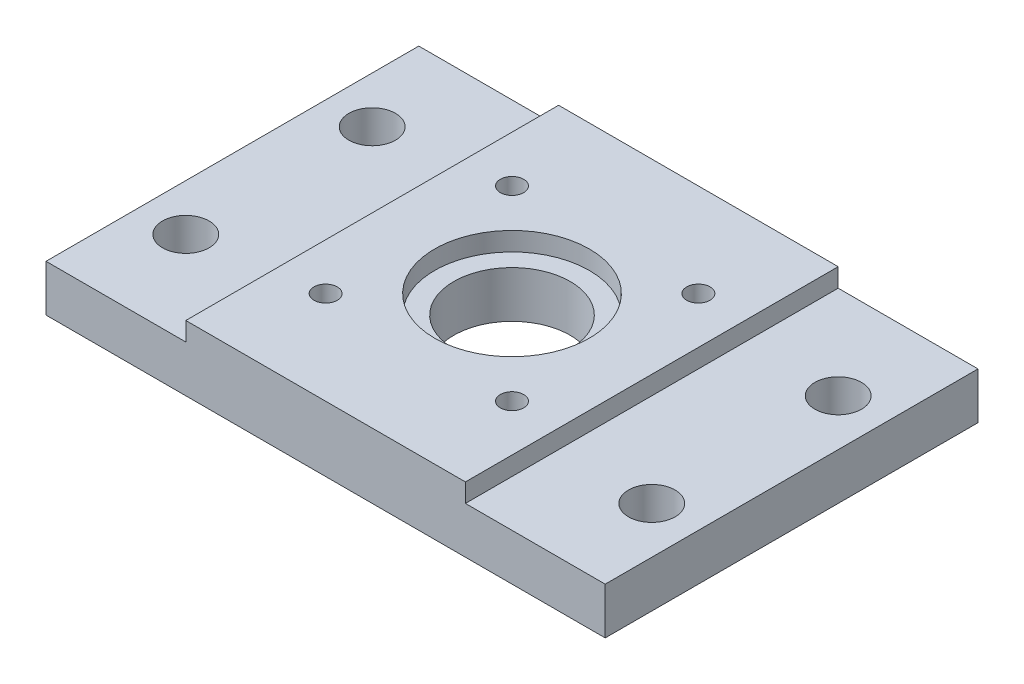
ISO-10303-21;
HEADER;
FILE_DESCRIPTION(('STEP AP214'),'2;1');
FILE_NAME('part.step','',(''),(''),'','','');
FILE_SCHEMA(('AUTOMOTIVE_DESIGN { 1 0 10303 214 1 1 1 1 }'));
ENDSEC;
DATA;
#1=APPLICATION_CONTEXT('core data for automotive mechanical design processes');
#2=APPLICATION_PROTOCOL_DEFINITION('international standard','automotive_design',2000,#1);
#3=PRODUCT_CONTEXT('',#1,'mechanical');
#4=PRODUCT('Part','Part','',(#3));
#5=PRODUCT_RELATED_PRODUCT_CATEGORY('part','',(#4));
#6=PRODUCT_DEFINITION_FORMATION('','',#4);
#7=PRODUCT_DEFINITION_CONTEXT('part definition',#1,'design');
#8=PRODUCT_DEFINITION('design','',#6,#7);
#9=PRODUCT_DEFINITION_SHAPE('','',#8);
#10=(LENGTH_UNIT() NAMED_UNIT(*) SI_UNIT(.MILLI.,.METRE.));
#11=(NAMED_UNIT(*) PLANE_ANGLE_UNIT() SI_UNIT($,.RADIAN.));
#12=(NAMED_UNIT(*) SI_UNIT($,.STERADIAN.) SOLID_ANGLE_UNIT());
#13=UNCERTAINTY_MEASURE_WITH_UNIT(LENGTH_MEASURE(1.E-05),#10,'distance_accuracy_value','');
#14=(GEOMETRIC_REPRESENTATION_CONTEXT(3) GLOBAL_UNCERTAINTY_ASSIGNED_CONTEXT((#13)) GLOBAL_UNIT_ASSIGNED_CONTEXT((#10,
#11,#12)) REPRESENTATION_CONTEXT('',''));
#15=CARTESIAN_POINT('',(0.,0.,0.));
#16=DIRECTION('',(0.,0.,1.));
#17=DIRECTION('',(1.,0.,0.));
#18=AXIS2_PLACEMENT_3D('',#15,#16,#17);
#19=CARTESIAN_POINT('',(0.,5.,0.));
#20=DIRECTION('',(0.,1.,0.));
#21=DIRECTION('',(0.,0.,1.));
#22=AXIS2_PLACEMENT_3D('',#19,#20,#21);
#23=PLANE('',#22);
#24=DIRECTION('',(0.,0.,1.));
#25=VECTOR('',#24,1.);
#26=CARTESIAN_POINT('',(-15.,5.,-20.));
#27=LINE('',#26,#25);
#28=CARTESIAN_POINT('',(-15.,5.,-20.));
#29=VERTEX_POINT('',#28);
#30=CARTESIAN_POINT('',(-15.,5.,20.));
#31=VERTEX_POINT('',#30);
#32=EDGE_CURVE('E48',#29,#31,#27,.T.);
#33=ORIENTED_EDGE('',*,*,#32,.F.);
#34=DIRECTION('',(-1.,0.,0.));
#35=VECTOR('',#34,1.);
#36=CARTESIAN_POINT('',(30.,5.,-20.));
#37=LINE('',#36,#35);
#38=CARTESIAN_POINT('',(-30.,5.,-20.));
#39=VERTEX_POINT('',#38);
#40=EDGE_CURVE('E165',#29,#39,#37,.T.);
#41=ORIENTED_EDGE('',*,*,#40,.T.);
#42=DIRECTION('',(0.,0.,1.));
#43=VECTOR('',#42,1.);
#44=CARTESIAN_POINT('',(-30.,5.,20.));
#45=LINE('',#44,#43);
#46=CARTESIAN_POINT('',(-30.,5.,20.));
#47=VERTEX_POINT('',#46);
#48=EDGE_CURVE('E156',#39,#47,#45,.T.);
#49=ORIENTED_EDGE('',*,*,#48,.T.);
#50=DIRECTION('',(1.,0.,0.));
#51=VECTOR('',#50,1.);
#52=CARTESIAN_POINT('',(30.,5.,20.));
#53=LINE('',#52,#51);
#54=EDGE_CURVE('E161',#47,#31,#53,.T.);
#55=ORIENTED_EDGE('',*,*,#54,.T.);
#56=EDGE_LOOP('',(#33,#41,#49,#55));
#57=FACE_BOUND('',#56,.T.);
#58=CARTESIAN_POINT('',(-25.,5.,-10.));
#59=DIRECTION('',(0.,1.,0.));
#60=DIRECTION('',(0.,0.,-1.));
#61=AXIS2_PLACEMENT_3D('',#58,#59,#60);
#62=CIRCLE('',#61,2.50000000000001);
#63=CARTESIAN_POINT('',(-25.,5.,-12.5));
#64=VERTEX_POINT('',#63);
#65=EDGE_CURVE('E123',#64,#64,#62,.T.);
#66=ORIENTED_EDGE('',*,*,#65,.F.);
#67=EDGE_LOOP('',(#66));
#68=FACE_BOUND('',#67,.T.);
#69=CARTESIAN_POINT('',(-25.,5.,10.));
#70=DIRECTION('',(0.,1.,0.));
#71=DIRECTION('',(0.,0.,-1.));
#72=AXIS2_PLACEMENT_3D('',#69,#70,#71);
#73=CIRCLE('',#72,2.50000000000001);
#74=CARTESIAN_POINT('',(-25.,5.,7.49999999999999));
#75=VERTEX_POINT('',#74);
#76=EDGE_CURVE('E132',#75,#75,#73,.T.);
#77=ORIENTED_EDGE('',*,*,#76,.F.);
#78=EDGE_LOOP('',(#77));
#79=FACE_BOUND('',#78,.T.);
#80=ADVANCED_FACE('F33',(#57,#68,#79),#23,.T.);
#81=CARTESIAN_POINT('',(0.,5.,0.));
#82=DIRECTION('',(0.,1.,0.));
#83=DIRECTION('',(0.,0.,1.));
#84=AXIS2_PLACEMENT_3D('',#81,#82,#83);
#85=CIRCLE('',#84,6.25);
#86=CARTESIAN_POINT('',(0.,5.,6.25));
#87=VERTEX_POINT('',#86);
#88=EDGE_CURVE('E138',#87,#87,#85,.T.);
#89=ORIENTED_EDGE('',*,*,#88,.F.);
#90=EDGE_LOOP('',(#89));
#91=FACE_BOUND('',#90,.T.);
#92=CARTESIAN_POINT('',(0.,5.,0.));
#93=DIRECTION('',(0.,1.,0.));
#94=DIRECTION('',(0.,0.,1.));
#95=AXIS2_PLACEMENT_3D('',#92,#93,#94);
#96=CIRCLE('',#95,8.3);
#97=CARTESIAN_POINT('',(0.,5.,8.3));
#98=VERTEX_POINT('',#97);
#99=EDGE_CURVE('E209',#98,#98,#96,.T.);
#100=ORIENTED_EDGE('',*,*,#99,.T.);
#101=EDGE_LOOP('',(#100));
#102=FACE_BOUND('',#101,.T.);
#103=ADVANCED_FACE('F269',(#91,#102),#23,.T.);
#104=DIRECTION('',(0.,0.,-1.));
#105=VECTOR('',#104,1.);
#106=CARTESIAN_POINT('',(15.,5.,-20.));
#107=LINE('',#106,#105);
#108=CARTESIAN_POINT('',(15.,5.,20.));
#109=VERTEX_POINT('',#108);
#110=CARTESIAN_POINT('',(15.,5.,-20.));
#111=VERTEX_POINT('',#110);
#112=EDGE_CURVE('E56',#109,#111,#107,.T.);
#113=ORIENTED_EDGE('',*,*,#112,.F.);
#114=CARTESIAN_POINT('',(30.,5.,20.));
#115=VERTEX_POINT('',#114);
#116=EDGE_CURVE('E159',#109,#115,#53,.T.);
#117=ORIENTED_EDGE('',*,*,#116,.T.);
#118=DIRECTION('',(0.,0.,-1.));
#119=VECTOR('',#118,1.);
#120=CARTESIAN_POINT('',(30.,5.,20.));
#121=LINE('',#120,#119);
#122=CARTESIAN_POINT('',(30.,5.,-20.));
#123=VERTEX_POINT('',#122);
#124=EDGE_CURVE('E163',#115,#123,#121,.T.);
#125=ORIENTED_EDGE('',*,*,#124,.T.);
#126=EDGE_CURVE('E166',#123,#111,#37,.T.);
#127=ORIENTED_EDGE('',*,*,#126,.T.);
#128=EDGE_LOOP('',(#113,#117,#125,#127));
#129=FACE_BOUND('',#128,.T.);
#130=CARTESIAN_POINT('',(25.,5.,10.));
#131=DIRECTION('',(0.,1.,0.));
#132=DIRECTION('',(0.,0.,1.));
#133=AXIS2_PLACEMENT_3D('',#130,#131,#132);
#134=CIRCLE('',#133,2.5);
#135=CARTESIAN_POINT('',(25.,5.,12.5));
#136=VERTEX_POINT('',#135);
#137=EDGE_CURVE('E144',#136,#136,#134,.T.);
#138=ORIENTED_EDGE('',*,*,#137,.F.);
#139=EDGE_LOOP('',(#138));
#140=FACE_BOUND('',#139,.T.);
#141=CARTESIAN_POINT('',(25.,5.,-10.));
#142=DIRECTION('',(0.,1.,0.));
#143=DIRECTION('',(0.,0.,1.));
#144=AXIS2_PLACEMENT_3D('',#141,#142,#143);
#145=CIRCLE('',#144,2.5);
#146=CARTESIAN_POINT('',(25.,5.,-7.5));
#147=VERTEX_POINT('',#146);
#148=EDGE_CURVE('E150',#147,#147,#145,.T.);
#149=ORIENTED_EDGE('',*,*,#148,.F.);
#150=EDGE_LOOP('',(#149));
#151=FACE_BOUND('',#150,.T.);
#152=ADVANCED_FACE('F271',(#129,#140,#151),#23,.T.);
#153=CARTESIAN_POINT('',(0.,0.,0.));
#154=DIRECTION('',(0.,1.,0.));
#155=DIRECTION('',(0.,0.,1.));
#156=AXIS2_PLACEMENT_3D('',#153,#154,#155);
#157=PLANE('',#156);
#158=CARTESIAN_POINT('',(-10.,0.,10.));
#159=DIRECTION('',(0.,1.,0.));
#160=DIRECTION('',(0.,0.,1.));
#161=AXIS2_PLACEMENT_3D('',#158,#159,#160);
#162=CIRCLE('',#161,1.25);
#163=CARTESIAN_POINT('',(-10.,0.,11.25));
#164=VERTEX_POINT('',#163);
#165=EDGE_CURVE('E224',#164,#164,#162,.T.);
#166=ORIENTED_EDGE('',*,*,#165,.T.);
#167=EDGE_LOOP('',(#166));
#168=FACE_BOUND('',#167,.T.);
#169=CARTESIAN_POINT('',(10.,0.,9.99999999999999));
#170=DIRECTION('',(0.,1.,0.));
#171=DIRECTION('',(0.,0.,1.));
#172=AXIS2_PLACEMENT_3D('',#169,#170,#171);
#173=CIRCLE('',#172,1.25);
#174=CARTESIAN_POINT('',(10.,0.,11.25));
#175=VERTEX_POINT('',#174);
#176=EDGE_CURVE('E230',#175,#175,#173,.T.);
#177=ORIENTED_EDGE('',*,*,#176,.T.);
#178=EDGE_LOOP('',(#177));
#179=FACE_BOUND('',#178,.T.);
#180=CARTESIAN_POINT('',(10.,0.,-10.));
#181=DIRECTION('',(0.,1.,0.));
#182=DIRECTION('',(0.,0.,1.));
#183=AXIS2_PLACEMENT_3D('',#180,#181,#182);
#184=CIRCLE('',#183,1.25);
#185=CARTESIAN_POINT('',(10.,0.,-8.75));
#186=VERTEX_POINT('',#185);
#187=EDGE_CURVE('E218',#186,#186,#184,.T.);
#188=ORIENTED_EDGE('',*,*,#187,.T.);
#189=EDGE_LOOP('',(#188));
#190=FACE_BOUND('',#189,.T.);
#191=CARTESIAN_POINT('',(-10.,0.,-10.));
#192=DIRECTION('',(0.,1.,0.));
#193=DIRECTION('',(0.,0.,1.));
#194=AXIS2_PLACEMENT_3D('',#191,#192,#193);
#195=CIRCLE('',#194,1.25);
#196=CARTESIAN_POINT('',(-10.,0.,-8.75));
#197=VERTEX_POINT('',#196);
#198=EDGE_CURVE('E212',#197,#197,#195,.T.);
#199=ORIENTED_EDGE('',*,*,#198,.T.);
#200=EDGE_LOOP('',(#199));
#201=FACE_BOUND('',#200,.T.);
#202=DIRECTION('',(0.,0.,1.));
#203=VECTOR('',#202,1.);
#204=CARTESIAN_POINT('',(-30.,0.,20.));
#205=LINE('',#204,#203);
#206=CARTESIAN_POINT('',(-30.,0.,-20.));
#207=VERTEX_POINT('',#206);
#208=CARTESIAN_POINT('',(-30.,0.,20.));
#209=VERTEX_POINT('',#208);
#210=EDGE_CURVE('E153',#207,#209,#205,.T.);
#211=ORIENTED_EDGE('',*,*,#210,.F.);
#212=DIRECTION('',(-1.,0.,0.));
#213=VECTOR('',#212,1.);
#214=CARTESIAN_POINT('',(30.,0.,-20.));
#215=LINE('',#214,#213);
#216=CARTESIAN_POINT('',(30.,0.,-20.));
#217=VERTEX_POINT('',#216);
#218=EDGE_CURVE('E160',#217,#207,#215,.T.);
#219=ORIENTED_EDGE('',*,*,#218,.F.);
#220=DIRECTION('',(0.,0.,-1.));
#221=VECTOR('',#220,1.);
#222=CARTESIAN_POINT('',(30.,0.,20.));
#223=LINE('',#222,#221);
#224=CARTESIAN_POINT('',(30.,0.,20.));
#225=VERTEX_POINT('',#224);
#226=EDGE_CURVE('E173',#225,#217,#223,.T.);
#227=ORIENTED_EDGE('',*,*,#226,.F.);
#228=DIRECTION('',(1.,0.,0.));
#229=VECTOR('',#228,1.);
#230=CARTESIAN_POINT('',(30.,0.,20.));
#231=LINE('',#230,#229);
#232=EDGE_CURVE('E171',#209,#225,#231,.T.);
#233=ORIENTED_EDGE('',*,*,#232,.F.);
#234=EDGE_LOOP('',(#211,#219,#227,#233));
#235=FACE_BOUND('',#234,.T.);
#236=CARTESIAN_POINT('',(25.,0.,-10.));
#237=DIRECTION('',(0.,1.,0.));
#238=DIRECTION('',(0.,0.,1.));
#239=AXIS2_PLACEMENT_3D('',#236,#237,#238);
#240=CIRCLE('',#239,2.5);
#241=CARTESIAN_POINT('',(25.,0.,-7.5));
#242=VERTEX_POINT('',#241);
#243=EDGE_CURVE('E147',#242,#242,#240,.T.);
#244=ORIENTED_EDGE('',*,*,#243,.T.);
#245=EDGE_LOOP('',(#244));
#246=FACE_BOUND('',#245,.T.);
#247=CARTESIAN_POINT('',(25.,0.,10.));
#248=DIRECTION('',(0.,1.,0.));
#249=DIRECTION('',(0.,0.,1.));
#250=AXIS2_PLACEMENT_3D('',#247,#248,#249);
#251=CIRCLE('',#250,2.5);
#252=CARTESIAN_POINT('',(25.,0.,12.5));
#253=VERTEX_POINT('',#252);
#254=EDGE_CURVE('E141',#253,#253,#251,.T.);
#255=ORIENTED_EDGE('',*,*,#254,.T.);
#256=EDGE_LOOP('',(#255));
#257=FACE_BOUND('',#256,.T.);
#258=CARTESIAN_POINT('',(0.,0.,0.));
#259=DIRECTION('',(0.,1.,0.));
#260=DIRECTION('',(0.,0.,1.));
#261=AXIS2_PLACEMENT_3D('',#258,#259,#260);
#262=CIRCLE('',#261,6.25);
#263=CARTESIAN_POINT('',(0.,0.,6.25));
#264=VERTEX_POINT('',#263);
#265=EDGE_CURVE('E135',#264,#264,#262,.T.);
#266=ORIENTED_EDGE('',*,*,#265,.T.);
#267=EDGE_LOOP('',(#266));
#268=FACE_BOUND('',#267,.T.);
#269=CARTESIAN_POINT('',(-25.,0.,10.));
#270=DIRECTION('',(0.,1.,0.));
#271=DIRECTION('',(0.,0.,-1.));
#272=AXIS2_PLACEMENT_3D('',#269,#270,#271);
#273=CIRCLE('',#272,2.50000000000001);
#274=CARTESIAN_POINT('',(-25.,0.,7.49999999999999));
#275=VERTEX_POINT('',#274);
#276=EDGE_CURVE('E130',#275,#275,#273,.T.);
#277=ORIENTED_EDGE('',*,*,#276,.T.);
#278=EDGE_LOOP('',(#277));
#279=FACE_BOUND('',#278,.T.);
#280=CARTESIAN_POINT('',(-25.,0.,-10.));
#281=DIRECTION('',(0.,1.,0.));
#282=DIRECTION('',(0.,0.,-1.));
#283=AXIS2_PLACEMENT_3D('',#280,#281,#282);
#284=CIRCLE('',#283,2.50000000000001);
#285=CARTESIAN_POINT('',(-25.,0.,-12.5));
#286=VERTEX_POINT('',#285);
#287=EDGE_CURVE('E120',#286,#286,#284,.T.);
#288=ORIENTED_EDGE('',*,*,#287,.T.);
#289=EDGE_LOOP('',(#288));
#290=FACE_BOUND('',#289,.T.);
#291=ADVANCED_FACE('F190',(#168,#179,#190,#201,#235,#246,#257,#268,#279,#290),#157,.F.);
#292=CARTESIAN_POINT('',(-30.,5.,20.));
#293=DIRECTION('',(1.,0.,0.));
#294=DIRECTION('',(0.,0.,-1.));
#295=AXIS2_PLACEMENT_3D('',#292,#293,#294);
#296=PLANE('',#295);
#297=ORIENTED_EDGE('',*,*,#210,.T.);
#298=DIRECTION('',(0.,-1.,0.));
#299=VECTOR('',#298,1.);
#300=CARTESIAN_POINT('',(-30.,5.,20.));
#301=LINE('',#300,#299);
#302=EDGE_CURVE('E11',#47,#209,#301,.T.);
#303=ORIENTED_EDGE('',*,*,#302,.F.);
#304=ORIENTED_EDGE('',*,*,#48,.F.);
#305=DIRECTION('',(0.,-1.,0.));
#306=VECTOR('',#305,1.);
#307=CARTESIAN_POINT('',(-30.,5.,-20.));
#308=LINE('',#307,#306);
#309=EDGE_CURVE('E168',#39,#207,#308,.T.);
#310=ORIENTED_EDGE('',*,*,#309,.T.);
#311=EDGE_LOOP('',(#297,#303,#304,#310));
#312=FACE_BOUND('',#311,.T.);
#313=ADVANCED_FACE('F35',(#312),#296,.F.);
#314=CARTESIAN_POINT('',(30.,5.,20.));
#315=DIRECTION('',(0.,0.,-1.));
#316=DIRECTION('',(-1.,0.,0.));
#317=AXIS2_PLACEMENT_3D('',#314,#315,#316);
#318=PLANE('',#317);
#319=ORIENTED_EDGE('',*,*,#232,.T.);
#320=DIRECTION('',(0.,-1.,0.));
#321=VECTOR('',#320,1.);
#322=CARTESIAN_POINT('',(30.,5.,20.));
#323=LINE('',#322,#321);
#324=EDGE_CURVE('E41',#115,#225,#323,.T.);
#325=ORIENTED_EDGE('',*,*,#324,.F.);
#326=ORIENTED_EDGE('',*,*,#116,.F.);
#327=DIRECTION('',(0.,-1.,0.));
#328=VECTOR('',#327,1.);
#329=CARTESIAN_POINT('',(15.,7.,20.));
#330=LINE('',#329,#328);
#331=CARTESIAN_POINT('',(15.,7.,20.));
#332=VERTEX_POINT('',#331);
#333=EDGE_CURVE('E104',#332,#109,#330,.T.);
#334=ORIENTED_EDGE('',*,*,#333,.F.);
#335=DIRECTION('',(1.,0.,0.));
#336=VECTOR('',#335,1.);
#337=CARTESIAN_POINT('',(-15.,7.,20.));
#338=LINE('',#337,#336);
#339=CARTESIAN_POINT('',(-15.,7.,20.));
#340=VERTEX_POINT('',#339);
#341=EDGE_CURVE('E98',#340,#332,#338,.T.);
#342=ORIENTED_EDGE('',*,*,#341,.F.);
#343=DIRECTION('',(0.,-1.,0.));
#344=VECTOR('',#343,1.);
#345=CARTESIAN_POINT('',(-15.,7.,20.));
#346=LINE('',#345,#344);
#347=EDGE_CURVE('E102',#340,#31,#346,.T.);
#348=ORIENTED_EDGE('',*,*,#347,.T.);
#349=ORIENTED_EDGE('',*,*,#54,.F.);
#350=ORIENTED_EDGE('',*,*,#302,.T.);
#351=EDGE_LOOP('',(#319,#325,#326,#334,#342,#348,#349,#350));
#352=FACE_BOUND('',#351,.T.);
#353=ADVANCED_FACE('F100',(#352),#318,.F.);
#354=CARTESIAN_POINT('',(30.,5.,20.));
#355=DIRECTION('',(-1.,0.,0.));
#356=DIRECTION('',(0.,0.,1.));
#357=AXIS2_PLACEMENT_3D('',#354,#355,#356);
#358=PLANE('',#357);
#359=ORIENTED_EDGE('',*,*,#226,.T.);
#360=DIRECTION('',(0.,-1.,0.));
#361=VECTOR('',#360,1.);
#362=CARTESIAN_POINT('',(30.,5.,-20.));
#363=LINE('',#362,#361);
#364=EDGE_CURVE('E178',#123,#217,#363,.T.);
#365=ORIENTED_EDGE('',*,*,#364,.F.);
#366=ORIENTED_EDGE('',*,*,#124,.F.);
#367=ORIENTED_EDGE('',*,*,#324,.T.);
#368=EDGE_LOOP('',(#359,#365,#366,#367));
#369=FACE_BOUND('',#368,.T.);
#370=ADVANCED_FACE('F185',(#369),#358,.F.);
#371=CARTESIAN_POINT('',(30.,5.,-20.));
#372=DIRECTION('',(0.,0.,1.));
#373=DIRECTION('',(1.,0.,0.));
#374=AXIS2_PLACEMENT_3D('',#371,#372,#373);
#375=PLANE('',#374);
#376=ORIENTED_EDGE('',*,*,#218,.T.);
#377=ORIENTED_EDGE('',*,*,#309,.F.);
#378=ORIENTED_EDGE('',*,*,#40,.F.);
#379=DIRECTION('',(0.,-1.,0.));
#380=VECTOR('',#379,1.);
#381=CARTESIAN_POINT('',(-15.,7.,-20.));
#382=LINE('',#381,#380);
#383=CARTESIAN_POINT('',(-15.,7.,-20.));
#384=VERTEX_POINT('',#383);
#385=EDGE_CURVE('E200',#384,#29,#382,.T.);
#386=ORIENTED_EDGE('',*,*,#385,.F.);
#387=DIRECTION('',(-1.,0.,0.));
#388=VECTOR('',#387,1.);
#389=CARTESIAN_POINT('',(-15.,7.,-20.));
#390=LINE('',#389,#388);
#391=CARTESIAN_POINT('',(15.,7.,-20.));
#392=VERTEX_POINT('',#391);
#393=EDGE_CURVE('E114',#392,#384,#390,.T.);
#394=ORIENTED_EDGE('',*,*,#393,.F.);
#395=DIRECTION('',(0.,-1.,0.));
#396=VECTOR('',#395,1.);
#397=CARTESIAN_POINT('',(15.,7.,-20.));
#398=LINE('',#397,#396);
#399=EDGE_CURVE('E125',#392,#111,#398,.T.);
#400=ORIENTED_EDGE('',*,*,#399,.T.);
#401=ORIENTED_EDGE('',*,*,#126,.F.);
#402=ORIENTED_EDGE('',*,*,#364,.T.);
#403=EDGE_LOOP('',(#376,#377,#378,#386,#394,#400,#401,#402));
#404=FACE_BOUND('',#403,.T.);
#405=ADVANCED_FACE('F194',(#404),#375,.F.);
#406=CARTESIAN_POINT('',(25.,5.,-10.));
#407=DIRECTION('',(0.,-1.,0.));
#408=DIRECTION('',(0.,0.,-1.));
#409=AXIS2_PLACEMENT_3D('',#406,#407,#408);
#410=CYLINDRICAL_SURFACE('',#409,2.5);
#411=ORIENTED_EDGE('',*,*,#148,.T.);
#412=EDGE_LOOP('',(#411));
#413=FACE_BOUND('',#412,.T.);
#414=ORIENTED_EDGE('',*,*,#243,.F.);
#415=EDGE_LOOP('',(#414));
#416=FACE_BOUND('',#415,.T.);
#417=ADVANCED_FACE('F288',(#413,#416),#410,.F.);
#418=CARTESIAN_POINT('',(25.,5.,10.));
#419=DIRECTION('',(0.,-1.,0.));
#420=DIRECTION('',(0.,0.,-1.));
#421=AXIS2_PLACEMENT_3D('',#418,#419,#420);
#422=CYLINDRICAL_SURFACE('',#421,2.5);
#423=ORIENTED_EDGE('',*,*,#137,.T.);
#424=EDGE_LOOP('',(#423));
#425=FACE_BOUND('',#424,.T.);
#426=ORIENTED_EDGE('',*,*,#254,.F.);
#427=EDGE_LOOP('',(#426));
#428=FACE_BOUND('',#427,.T.);
#429=ADVANCED_FACE('F291',(#425,#428),#422,.F.);
#430=CARTESIAN_POINT('',(0.,5.,0.));
#431=DIRECTION('',(0.,-1.,0.));
#432=DIRECTION('',(0.,0.,-1.));
#433=AXIS2_PLACEMENT_3D('',#430,#431,#432);
#434=CYLINDRICAL_SURFACE('',#433,6.25);
#435=ORIENTED_EDGE('',*,*,#88,.T.);
#436=EDGE_LOOP('',(#435));
#437=FACE_BOUND('',#436,.T.);
#438=ORIENTED_EDGE('',*,*,#265,.F.);
#439=EDGE_LOOP('',(#438));
#440=FACE_BOUND('',#439,.T.);
#441=ADVANCED_FACE('F309',(#437,#440),#434,.F.);
#442=CARTESIAN_POINT('',(-25.,5.,10.));
#443=DIRECTION('',(0.,-1.,0.));
#444=DIRECTION('',(0.,0.,-1.));
#445=AXIS2_PLACEMENT_3D('',#442,#443,#444);
#446=CYLINDRICAL_SURFACE('',#445,2.50000000000001);
#447=ORIENTED_EDGE('',*,*,#76,.T.);
#448=EDGE_LOOP('',(#447));
#449=FACE_BOUND('',#448,.T.);
#450=ORIENTED_EDGE('',*,*,#276,.F.);
#451=EDGE_LOOP('',(#450));
#452=FACE_BOUND('',#451,.T.);
#453=ADVANCED_FACE('F303',(#449,#452),#446,.F.);
#454=CARTESIAN_POINT('',(-25.,5.,-10.));
#455=DIRECTION('',(0.,-1.,0.));
#456=DIRECTION('',(0.,0.,-1.));
#457=AXIS2_PLACEMENT_3D('',#454,#455,#456);
#458=CYLINDRICAL_SURFACE('',#457,2.50000000000001);
#459=ORIENTED_EDGE('',*,*,#65,.T.);
#460=EDGE_LOOP('',(#459));
#461=FACE_BOUND('',#460,.T.);
#462=ORIENTED_EDGE('',*,*,#287,.F.);
#463=EDGE_LOOP('',(#462));
#464=FACE_BOUND('',#463,.T.);
#465=ADVANCED_FACE('F251',(#461,#464),#458,.F.);
#466=CARTESIAN_POINT('',(0.,7.,0.));
#467=DIRECTION('',(0.,1.,0.));
#468=DIRECTION('',(0.,0.,1.));
#469=AXIS2_PLACEMENT_3D('',#466,#467,#468);
#470=PLANE('',#469);
#471=CARTESIAN_POINT('',(-10.,7.,10.));
#472=DIRECTION('',(0.,1.,0.));
#473=DIRECTION('',(0.,0.,1.));
#474=AXIS2_PLACEMENT_3D('',#471,#472,#473);
#475=CIRCLE('',#474,1.25);
#476=CARTESIAN_POINT('',(-10.,7.,11.25));
#477=VERTEX_POINT('',#476);
#478=EDGE_CURVE('E221',#477,#477,#475,.T.);
#479=ORIENTED_EDGE('',*,*,#478,.F.);
#480=EDGE_LOOP('',(#479));
#481=FACE_BOUND('',#480,.T.);
#482=CARTESIAN_POINT('',(10.,7.,9.99999999999999));
#483=DIRECTION('',(0.,1.,0.));
#484=DIRECTION('',(0.,0.,1.));
#485=AXIS2_PLACEMENT_3D('',#482,#483,#484);
#486=CIRCLE('',#485,1.25);
#487=CARTESIAN_POINT('',(10.,7.,11.25));
#488=VERTEX_POINT('',#487);
#489=EDGE_CURVE('E227',#488,#488,#486,.T.);
#490=ORIENTED_EDGE('',*,*,#489,.F.);
#491=EDGE_LOOP('',(#490));
#492=FACE_BOUND('',#491,.T.);
#493=CARTESIAN_POINT('',(10.,7.,-10.));
#494=DIRECTION('',(0.,1.,0.));
#495=DIRECTION('',(0.,0.,1.));
#496=AXIS2_PLACEMENT_3D('',#493,#494,#495);
#497=CIRCLE('',#496,1.25);
#498=CARTESIAN_POINT('',(10.,7.,-8.75));
#499=VERTEX_POINT('',#498);
#500=EDGE_CURVE('E233',#499,#499,#497,.T.);
#501=ORIENTED_EDGE('',*,*,#500,.F.);
#502=EDGE_LOOP('',(#501));
#503=FACE_BOUND('',#502,.T.);
#504=CARTESIAN_POINT('',(-10.,7.,-10.));
#505=DIRECTION('',(0.,1.,0.));
#506=DIRECTION('',(0.,0.,1.));
#507=AXIS2_PLACEMENT_3D('',#504,#505,#506);
#508=CIRCLE('',#507,1.25);
#509=CARTESIAN_POINT('',(-10.,7.,-8.75));
#510=VERTEX_POINT('',#509);
#511=EDGE_CURVE('E215',#510,#510,#508,.T.);
#512=ORIENTED_EDGE('',*,*,#511,.F.);
#513=EDGE_LOOP('',(#512));
#514=FACE_BOUND('',#513,.T.);
#515=DIRECTION('',(0.,0.,1.));
#516=VECTOR('',#515,1.);
#517=CARTESIAN_POINT('',(-15.,7.,-20.));
#518=LINE('',#517,#516);
#519=EDGE_CURVE('E108',#384,#340,#518,.T.);
#520=ORIENTED_EDGE('',*,*,#519,.T.);
#521=ORIENTED_EDGE('',*,*,#341,.T.);
#522=DIRECTION('',(0.,0.,-1.));
#523=VECTOR('',#522,1.);
#524=CARTESIAN_POINT('',(15.,7.,-20.));
#525=LINE('',#524,#523);
#526=EDGE_CURVE('E107',#332,#392,#525,.T.);
#527=ORIENTED_EDGE('',*,*,#526,.T.);
#528=ORIENTED_EDGE('',*,*,#393,.T.);
#529=EDGE_LOOP('',(#520,#521,#527,#528));
#530=FACE_BOUND('',#529,.T.);
#531=CARTESIAN_POINT('',(0.,7.,0.));
#532=DIRECTION('',(0.,1.,0.));
#533=DIRECTION('',(0.,0.,1.));
#534=AXIS2_PLACEMENT_3D('',#531,#532,#533);
#535=CIRCLE('',#534,8.3);
#536=CARTESIAN_POINT('',(0.,7.,8.3));
#537=VERTEX_POINT('',#536);
#538=EDGE_CURVE('E206',#537,#537,#535,.T.);
#539=ORIENTED_EDGE('',*,*,#538,.F.);
#540=EDGE_LOOP('',(#539));
#541=FACE_BOUND('',#540,.T.);
#542=ADVANCED_FACE('F111',(#481,#492,#503,#514,#530,#541),#470,.T.);
#543=CARTESIAN_POINT('',(-15.,7.,-20.));
#544=DIRECTION('',(1.,0.,0.));
#545=DIRECTION('',(0.,0.,-1.));
#546=AXIS2_PLACEMENT_3D('',#543,#544,#545);
#547=PLANE('',#546);
#548=ORIENTED_EDGE('',*,*,#32,.T.);
#549=ORIENTED_EDGE('',*,*,#347,.F.);
#550=ORIENTED_EDGE('',*,*,#519,.F.);
#551=ORIENTED_EDGE('',*,*,#385,.T.);
#552=EDGE_LOOP('',(#548,#549,#550,#551));
#553=FACE_BOUND('',#552,.T.);
#554=ADVANCED_FACE('F119',(#553),#547,.F.);
#555=CARTESIAN_POINT('',(15.,7.,-20.));
#556=DIRECTION('',(-1.,0.,0.));
#557=DIRECTION('',(0.,0.,1.));
#558=AXIS2_PLACEMENT_3D('',#555,#556,#557);
#559=PLANE('',#558);
#560=ORIENTED_EDGE('',*,*,#112,.T.);
#561=ORIENTED_EDGE('',*,*,#399,.F.);
#562=ORIENTED_EDGE('',*,*,#526,.F.);
#563=ORIENTED_EDGE('',*,*,#333,.T.);
#564=EDGE_LOOP('',(#560,#561,#562,#563));
#565=FACE_BOUND('',#564,.T.);
#566=ADVANCED_FACE('F263',(#565),#559,.F.);
#567=CARTESIAN_POINT('',(0.,7.,0.));
#568=DIRECTION('',(0.,-1.,0.));
#569=DIRECTION('',(0.,0.,-1.));
#570=AXIS2_PLACEMENT_3D('',#567,#568,#569);
#571=CYLINDRICAL_SURFACE('',#570,8.3);
#572=ORIENTED_EDGE('',*,*,#538,.T.);
#573=EDGE_LOOP('',(#572));
#574=FACE_BOUND('',#573,.T.);
#575=ORIENTED_EDGE('',*,*,#99,.F.);
#576=EDGE_LOOP('',(#575));
#577=FACE_BOUND('',#576,.T.);
#578=ADVANCED_FACE('F257',(#574,#577),#571,.F.);
#579=CARTESIAN_POINT('',(-10.,0.,-10.));
#580=DIRECTION('',(0.,1.,0.));
#581=DIRECTION('',(0.,0.,1.));
#582=AXIS2_PLACEMENT_3D('',#579,#580,#581);
#583=CYLINDRICAL_SURFACE('',#582,1.25);
#584=ORIENTED_EDGE('',*,*,#198,.F.);
#585=EDGE_LOOP('',(#584));
#586=FACE_BOUND('',#585,.T.);
#587=ORIENTED_EDGE('',*,*,#511,.T.);
#588=EDGE_LOOP('',(#587));
#589=FACE_BOUND('',#588,.T.);
#590=ADVANCED_FACE('F245',(#586,#589),#583,.F.);
#591=CARTESIAN_POINT('',(10.,0.,-10.));
#592=DIRECTION('',(0.,1.,0.));
#593=DIRECTION('',(0.,0.,1.));
#594=AXIS2_PLACEMENT_3D('',#591,#592,#593);
#595=CYLINDRICAL_SURFACE('',#594,1.25);
#596=ORIENTED_EDGE('',*,*,#187,.F.);
#597=EDGE_LOOP('',(#596));
#598=FACE_BOUND('',#597,.T.);
#599=ORIENTED_EDGE('',*,*,#500,.T.);
#600=EDGE_LOOP('',(#599));
#601=FACE_BOUND('',#600,.T.);
#602=ADVANCED_FACE('F241',(#598,#601),#595,.F.);
#603=CARTESIAN_POINT('',(10.,0.,9.99999999999999));
#604=DIRECTION('',(0.,1.,0.));
#605=DIRECTION('',(0.,0.,1.));
#606=AXIS2_PLACEMENT_3D('',#603,#604,#605);
#607=CYLINDRICAL_SURFACE('',#606,1.25);
#608=ORIENTED_EDGE('',*,*,#176,.F.);
#609=EDGE_LOOP('',(#608));
#610=FACE_BOUND('',#609,.T.);
#611=ORIENTED_EDGE('',*,*,#489,.T.);
#612=EDGE_LOOP('',(#611));
#613=FACE_BOUND('',#612,.T.);
#614=ADVANCED_FACE('F244',(#610,#613),#607,.F.);
#615=CARTESIAN_POINT('',(-10.,0.,10.));
#616=DIRECTION('',(0.,1.,0.));
#617=DIRECTION('',(0.,0.,1.));
#618=AXIS2_PLACEMENT_3D('',#615,#616,#617);
#619=CYLINDRICAL_SURFACE('',#618,1.25);
#620=ORIENTED_EDGE('',*,*,#165,.F.);
#621=EDGE_LOOP('',(#620));
#622=FACE_BOUND('',#621,.T.);
#623=ORIENTED_EDGE('',*,*,#478,.T.);
#624=EDGE_LOOP('',(#623));
#625=FACE_BOUND('',#624,.T.);
#626=ADVANCED_FACE('F423',(#622,#625),#619,.F.);
#627=CLOSED_SHELL('',(#80,#103,#152,#291,#313,#353,#370,#405,#417,#429,#441,#453,#465,#542,#554,
#566,#578,#590,#602,#614,#626));
#628=MANIFOLD_SOLID_BREP('B2',#627);
#629=ADVANCED_BREP_SHAPE_REPRESENTATION('',(#18,#628),#14);
#630=SHAPE_DEFINITION_REPRESENTATION(#9,#629);
ENDSEC;
END-ISO-10303-21;
